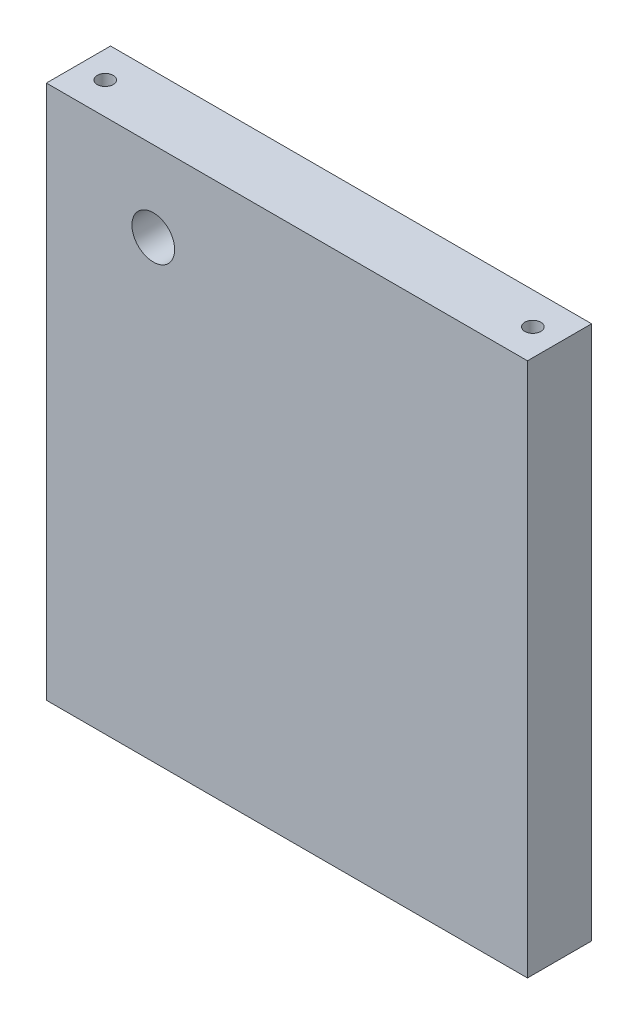
ISO-10303-21;
HEADER;
FILE_DESCRIPTION(('STEP AP214'),'2;1');
FILE_NAME('part.step','',(''),(''),'','','');
FILE_SCHEMA(('AUTOMOTIVE_DESIGN { 1 0 10303 214 1 1 1 1 }'));
ENDSEC;
DATA;
#1=APPLICATION_CONTEXT('core data for automotive mechanical design processes');
#2=APPLICATION_PROTOCOL_DEFINITION('international standard','automotive_design',2000,#1);
#3=PRODUCT_CONTEXT('',#1,'mechanical');
#4=PRODUCT('Part','Part','',(#3));
#5=PRODUCT_RELATED_PRODUCT_CATEGORY('part','',(#4));
#6=PRODUCT_DEFINITION_FORMATION('','',#4);
#7=PRODUCT_DEFINITION_CONTEXT('part definition',#1,'design');
#8=PRODUCT_DEFINITION('design','',#6,#7);
#9=PRODUCT_DEFINITION_SHAPE('','',#8);
#10=(LENGTH_UNIT() NAMED_UNIT(*) SI_UNIT(.MILLI.,.METRE.));
#11=(NAMED_UNIT(*) PLANE_ANGLE_UNIT() SI_UNIT($,.RADIAN.));
#12=(NAMED_UNIT(*) SI_UNIT($,.STERADIAN.) SOLID_ANGLE_UNIT());
#13=UNCERTAINTY_MEASURE_WITH_UNIT(LENGTH_MEASURE(1.E-05),#10,'distance_accuracy_value','');
#14=(GEOMETRIC_REPRESENTATION_CONTEXT(3) GLOBAL_UNCERTAINTY_ASSIGNED_CONTEXT((#13)) GLOBAL_UNIT_ASSIGNED_CONTEXT((#10,
#11,#12)) REPRESENTATION_CONTEXT('',''));
#15=CARTESIAN_POINT('',(0.,0.,0.));
#16=DIRECTION('',(0.,0.,1.));
#17=DIRECTION('',(1.,0.,0.));
#18=AXIS2_PLACEMENT_3D('',#15,#16,#17);
#19=CARTESIAN_POINT('',(0.,0.,0.));
#20=DIRECTION('',(0.,0.,1.));
#21=DIRECTION('',(1.,0.,0.));
#22=AXIS2_PLACEMENT_3D('',#19,#20,#21);
#23=PLANE('',#22);
#24=CARTESIAN_POINT('',(-82.9288397512637,45.9947342019556,0.));
#25=DIRECTION('',(0.,0.,1.));
#26=DIRECTION('',(1.,0.,0.));
#27=AXIS2_PLACEMENT_3D('',#24,#25,#26);
#28=CIRCLE('',#27,4.00000000000002);
#29=CARTESIAN_POINT('',(-78.9288397512637,45.9947342019556,0.));
#30=VERTEX_POINT('',#29);
#31=EDGE_CURVE('E619',#30,#30,#28,.T.);
#32=ORIENTED_EDGE('',*,*,#31,.T.);
#33=EDGE_LOOP('',(#32));
#34=FACE_BOUND('',#33,.T.);
#35=DIRECTION('',(0.,-1.,0.));
#36=VECTOR('',#35,1.);
#37=CARTESIAN_POINT('',(-44.9288397512637,0.,0.));
#38=LINE('',#37,#36);
#39=CARTESIAN_POINT('',(-44.9288397512637,47.5914000237829,0.));
#40=VERTEX_POINT('',#39);
#41=CARTESIAN_POINT('',(-44.9288397512637,-25.5627815535904,0.));
#42=VERTEX_POINT('',#41);
#43=EDGE_CURVE('E357',#40,#42,#38,.T.);
#44=ORIENTED_EDGE('',*,*,#43,.F.);
#45=DIRECTION('',(-0.707106781186549,-0.707106781186546,0.));
#46=VECTOR('',#45,1.);
#47=CARTESIAN_POINT('',(-41.2601198875232,51.2601198875234,0.));
#48=LINE('',#47,#46);
#49=CARTESIAN_POINT('',(-70.9288397512637,21.591400023783,0.));
#50=VERTEX_POINT('',#49);
#51=EDGE_CURVE('E257',#40,#50,#48,.T.);
#52=ORIENTED_EDGE('',*,*,#51,.T.);
#53=DIRECTION('',(0.,-1.,0.));
#54=VECTOR('',#53,1.);
#55=CARTESIAN_POINT('',(-70.9288397512637,0.,0.));
#56=LINE('',#55,#54);
#57=CARTESIAN_POINT('',(-70.9288397512637,-36.0052657980444,0.));
#58=VERTEX_POINT('',#57);
#59=EDGE_CURVE('E364',#50,#58,#56,.T.);
#60=ORIENTED_EDGE('',*,*,#59,.T.);
#61=DIRECTION('',(-1.,0.,0.));
#62=VECTOR('',#61,1.);
#63=CARTESIAN_POINT('',(0.,-36.0052657980444,0.));
#64=LINE('',#63,#62);
#65=CARTESIAN_POINT('',(-54.1286833085984,-36.0052657980444,0.));
#66=VERTEX_POINT('',#65);
#67=EDGE_CURVE('E367',#66,#58,#64,.T.);
#68=ORIENTED_EDGE('',*,*,#67,.F.);
#69=DIRECTION('',(-0.707106781186547,-0.707106781186548,0.));
#70=VECTOR('',#69,1.);
#71=CARTESIAN_POINT('',(-9.06170875527707,9.06170875527705,0.));
#72=LINE('',#71,#70);
#73=CARTESIAN_POINT('',(-45.807519407704,-27.68410189715,0.));
#74=VERTEX_POINT('',#73);
#75=EDGE_CURVE('E322',#74,#66,#72,.T.);
#76=ORIENTED_EDGE('',*,*,#75,.F.);
#77=CARTESIAN_POINT('',(-47.9288397512637,-25.5627815535904,0.));
#78=DIRECTION('',(0.,0.,1.));
#79=DIRECTION('',(1.,0.,0.));
#80=AXIS2_PLACEMENT_3D('',#77,#78,#79);
#81=CIRCLE('',#80,3.);
#82=EDGE_CURVE('E353',#42,#74,#81,.F.);
#83=ORIENTED_EDGE('',*,*,#82,.F.);
#84=EDGE_LOOP('',(#44,#52,#60,#68,#76,#83));
#85=FACE_BOUND('',#84,.T.);
#86=DIRECTION('',(0.,-1.,0.));
#87=VECTOR('',#86,1.);
#88=CARTESIAN_POINT('',(-102.928839751264,60.9947342019556,0.));
#89=LINE('',#88,#87);
#90=CARTESIAN_POINT('',(-102.928839751264,60.9947342019556,0.));
#91=VERTEX_POINT('',#90);
#92=CARTESIAN_POINT('',(-102.928839751264,-39.0052657980444,0.));
#93=VERTEX_POINT('',#92);
#94=EDGE_CURVE('E389',#91,#93,#89,.T.);
#95=ORIENTED_EDGE('',*,*,#94,.F.);
#96=DIRECTION('',(1.,0.,0.));
#97=VECTOR('',#96,1.);
#98=CARTESIAN_POINT('',(-102.928839751264,60.9947342019556,0.));
#99=LINE('',#98,#97);
#100=CARTESIAN_POINT('',(-12.9288397512637,60.9947342019556,0.));
#101=VERTEX_POINT('',#100);
#102=EDGE_CURVE('E408',#91,#101,#99,.T.);
#103=ORIENTED_EDGE('',*,*,#102,.T.);
#104=DIRECTION('',(0.,-1.,0.));
#105=VECTOR('',#104,1.);
#106=CARTESIAN_POINT('',(-12.9288397512637,60.9947342019556,0.));
#107=LINE('',#106,#105);
#108=CARTESIAN_POINT('',(-12.9288397512637,-39.0052657980444,0.));
#109=VERTEX_POINT('',#108);
#110=EDGE_CURVE('E427',#101,#109,#107,.T.);
#111=ORIENTED_EDGE('',*,*,#110,.T.);
#112=DIRECTION('',(1.,0.,0.));
#113=VECTOR('',#112,1.);
#114=CARTESIAN_POINT('',(-102.928839751264,-39.0052657980444,0.));
#115=LINE('',#114,#113);
#116=EDGE_CURVE('E423',#93,#109,#115,.T.);
#117=ORIENTED_EDGE('',*,*,#116,.F.);
#118=EDGE_LOOP('',(#95,#103,#111,#117));
#119=FACE_BOUND('',#118,.T.);
#120=ADVANCED_FACE('F42',(#34,#85,#119),#23,.F.);
#121=CARTESIAN_POINT('',(-102.928839751264,60.9947342019556,12.));
#122=DIRECTION('',(1.,0.,0.));
#123=DIRECTION('',(0.,1.,0.));
#124=AXIS2_PLACEMENT_3D('',#121,#122,#123);
#125=PLANE('',#124);
#126=ORIENTED_EDGE('',*,*,#94,.T.);
#127=DIRECTION('',(0.,0.,-1.));
#128=VECTOR('',#127,1.);
#129=CARTESIAN_POINT('',(-102.928839751264,-39.0052657980444,12.));
#130=LINE('',#129,#128);
#131=CARTESIAN_POINT('',(-102.928839751264,-39.0052657980444,12.));
#132=VERTEX_POINT('',#131);
#133=EDGE_CURVE('E442',#132,#93,#130,.T.);
#134=ORIENTED_EDGE('',*,*,#133,.F.);
#135=DIRECTION('',(0.,-1.,0.));
#136=VECTOR('',#135,1.);
#137=CARTESIAN_POINT('',(-102.928839751264,60.9947342019556,12.));
#138=LINE('',#137,#136);
#139=CARTESIAN_POINT('',(-102.928839751264,60.9947342019556,12.));
#140=VERTEX_POINT('',#139);
#141=EDGE_CURVE('E403',#140,#132,#138,.T.);
#142=ORIENTED_EDGE('',*,*,#141,.F.);
#143=DIRECTION('',(0.,0.,-1.));
#144=VECTOR('',#143,1.);
#145=CARTESIAN_POINT('',(-102.928839751264,60.9947342019556,12.));
#146=LINE('',#145,#144);
#147=EDGE_CURVE('E419',#140,#91,#146,.T.);
#148=ORIENTED_EDGE('',*,*,#147,.T.);
#149=EDGE_LOOP('',(#126,#134,#142,#148));
#150=FACE_BOUND('',#149,.T.);
#151=ADVANCED_FACE('F44',(#150),#125,.F.);
#152=CARTESIAN_POINT('',(-102.928839751264,-39.0052657980444,12.));
#153=DIRECTION('',(0.,1.,0.));
#154=DIRECTION('',(0.,0.,1.));
#155=AXIS2_PLACEMENT_3D('',#152,#153,#154);
#156=PLANE('',#155);
#157=CARTESIAN_POINT('',(-17.9288397512637,-39.0052657980444,5.99999999999999));
#158=DIRECTION('',(0.,1.,0.));
#159=DIRECTION('',(0.,0.,1.));
#160=AXIS2_PLACEMENT_3D('',#157,#158,#159);
#161=CIRCLE('',#160,1.5);
#162=CARTESIAN_POINT('',(-17.9288397512637,-39.0052657980444,7.5));
#163=VERTEX_POINT('',#162);
#164=EDGE_CURVE('E601',#163,#163,#161,.T.);
#165=ORIENTED_EDGE('',*,*,#164,.T.);
#166=EDGE_LOOP('',(#165));
#167=FACE_BOUND('',#166,.T.);
#168=CARTESIAN_POINT('',(-97.9288397512637,-39.0052657980444,6.));
#169=DIRECTION('',(0.,1.,0.));
#170=DIRECTION('',(0.,0.,1.));
#171=AXIS2_PLACEMENT_3D('',#168,#169,#170);
#172=CIRCLE('',#171,1.5);
#173=CARTESIAN_POINT('',(-97.9288397512637,-39.0052657980444,7.5));
#174=VERTEX_POINT('',#173);
#175=EDGE_CURVE('E604',#174,#174,#172,.T.);
#176=ORIENTED_EDGE('',*,*,#175,.T.);
#177=EDGE_LOOP('',(#176));
#178=FACE_BOUND('',#177,.T.);
#179=ORIENTED_EDGE('',*,*,#116,.T.);
#180=DIRECTION('',(0.,0.,-1.));
#181=VECTOR('',#180,1.);
#182=CARTESIAN_POINT('',(-12.9288397512637,-39.0052657980444,12.));
#183=LINE('',#182,#181);
#184=CARTESIAN_POINT('',(-12.9288397512637,-39.0052657980444,12.));
#185=VERTEX_POINT('',#184);
#186=EDGE_CURVE('E439',#185,#109,#183,.T.);
#187=ORIENTED_EDGE('',*,*,#186,.F.);
#188=DIRECTION('',(1.,0.,0.));
#189=VECTOR('',#188,1.);
#190=CARTESIAN_POINT('',(-102.928839751264,-39.0052657980444,12.));
#191=LINE('',#190,#189);
#192=EDGE_CURVE('E407',#132,#185,#191,.T.);
#193=ORIENTED_EDGE('',*,*,#192,.F.);
#194=ORIENTED_EDGE('',*,*,#133,.T.);
#195=EDGE_LOOP('',(#179,#187,#193,#194));
#196=FACE_BOUND('',#195,.T.);
#197=ADVANCED_FACE('F504',(#167,#178,#196),#156,.F.);
#198=CARTESIAN_POINT('',(-12.9288397512637,60.9947342019556,12.));
#199=DIRECTION('',(1.,0.,0.));
#200=DIRECTION('',(0.,1.,0.));
#201=AXIS2_PLACEMENT_3D('',#198,#199,#200);
#202=PLANE('',#201);
#203=ORIENTED_EDGE('',*,*,#110,.F.);
#204=DIRECTION('',(0.,0.,-1.));
#205=VECTOR('',#204,1.);
#206=CARTESIAN_POINT('',(-12.9288397512637,60.9947342019556,12.));
#207=LINE('',#206,#205);
#208=CARTESIAN_POINT('',(-12.9288397512637,60.9947342019556,12.));
#209=VERTEX_POINT('',#208);
#210=EDGE_CURVE('E436',#209,#101,#207,.T.);
#211=ORIENTED_EDGE('',*,*,#210,.F.);
#212=DIRECTION('',(0.,-1.,0.));
#213=VECTOR('',#212,1.);
#214=CARTESIAN_POINT('',(-12.9288397512637,60.9947342019556,12.));
#215=LINE('',#214,#213);
#216=EDGE_CURVE('E411',#209,#185,#215,.T.);
#217=ORIENTED_EDGE('',*,*,#216,.T.);
#218=ORIENTED_EDGE('',*,*,#186,.T.);
#219=EDGE_LOOP('',(#203,#211,#217,#218));
#220=FACE_BOUND('',#219,.T.);
#221=ADVANCED_FACE('F574',(#220),#202,.T.);
#222=CARTESIAN_POINT('',(-102.928839751264,60.9947342019556,12.));
#223=DIRECTION('',(0.,1.,0.));
#224=DIRECTION('',(0.,0.,1.));
#225=AXIS2_PLACEMENT_3D('',#222,#223,#224);
#226=PLANE('',#225);
#227=CARTESIAN_POINT('',(-17.9288397512637,60.9947342019556,5.99999999999999));
#228=DIRECTION('',(0.,1.,0.));
#229=DIRECTION('',(0.,0.,1.));
#230=AXIS2_PLACEMENT_3D('',#227,#228,#229);
#231=CIRCLE('',#230,1.5);
#232=CARTESIAN_POINT('',(-17.9288397512637,60.9947342019556,7.5));
#233=VERTEX_POINT('',#232);
#234=EDGE_CURVE('E607',#233,#233,#231,.T.);
#235=ORIENTED_EDGE('',*,*,#234,.F.);
#236=EDGE_LOOP('',(#235));
#237=FACE_BOUND('',#236,.T.);
#238=CARTESIAN_POINT('',(-97.9288397512637,60.9947342019556,6.));
#239=DIRECTION('',(0.,1.,0.));
#240=DIRECTION('',(0.,0.,1.));
#241=AXIS2_PLACEMENT_3D('',#238,#239,#240);
#242=CIRCLE('',#241,1.5);
#243=CARTESIAN_POINT('',(-97.9288397512637,60.9947342019556,7.5));
#244=VERTEX_POINT('',#243);
#245=EDGE_CURVE('E608',#244,#244,#242,.T.);
#246=ORIENTED_EDGE('',*,*,#245,.F.);
#247=EDGE_LOOP('',(#246));
#248=FACE_BOUND('',#247,.T.);
#249=ORIENTED_EDGE('',*,*,#102,.F.);
#250=ORIENTED_EDGE('',*,*,#147,.F.);
#251=DIRECTION('',(1.,0.,0.));
#252=VECTOR('',#251,1.);
#253=CARTESIAN_POINT('',(-102.928839751264,60.9947342019556,12.));
#254=LINE('',#253,#252);
#255=EDGE_CURVE('E415',#140,#209,#254,.T.);
#256=ORIENTED_EDGE('',*,*,#255,.T.);
#257=ORIENTED_EDGE('',*,*,#210,.T.);
#258=EDGE_LOOP('',(#249,#250,#256,#257));
#259=FACE_BOUND('',#258,.T.);
#260=ADVANCED_FACE('F569',(#237,#248,#259),#226,.T.);
#261=CARTESIAN_POINT('',(0.,0.,12.));
#262=DIRECTION('',(0.,0.,1.));
#263=DIRECTION('',(1.,0.,0.));
#264=AXIS2_PLACEMENT_3D('',#261,#262,#263);
#265=PLANE('',#264);
#266=CARTESIAN_POINT('',(-82.9288397512637,45.9947342019556,12.));
#267=DIRECTION('',(0.,0.,1.));
#268=DIRECTION('',(1.,0.,0.));
#269=AXIS2_PLACEMENT_3D('',#266,#267,#268);
#270=CIRCLE('',#269,4.00000000000002);
#271=CARTESIAN_POINT('',(-78.9288397512637,45.9947342019556,12.));
#272=VERTEX_POINT('',#271);
#273=EDGE_CURVE('E261',#272,#272,#270,.T.);
#274=ORIENTED_EDGE('',*,*,#273,.F.);
#275=EDGE_LOOP('',(#274));
#276=FACE_BOUND('',#275,.T.);
#277=ORIENTED_EDGE('',*,*,#141,.T.);
#278=ORIENTED_EDGE('',*,*,#192,.T.);
#279=ORIENTED_EDGE('',*,*,#216,.F.);
#280=ORIENTED_EDGE('',*,*,#255,.F.);
#281=EDGE_LOOP('',(#277,#278,#279,#280));
#282=FACE_BOUND('',#281,.T.);
#283=ADVANCED_FACE('F567',(#276,#282),#265,.T.);
#284=CARTESIAN_POINT('',(-9.06170875527707,9.06170875527705,3.));
#285=DIRECTION('',(0.707106781186548,-0.707106781186547,0.));
#286=DIRECTION('',(0.707106781186547,0.707106781186548,0.));
#287=AXIS2_PLACEMENT_3D('',#284,#285,#286);
#288=PLANE('',#287);
#289=ORIENTED_EDGE('',*,*,#75,.T.);
#290=DIRECTION('',(0.,0.,-1.));
#291=VECTOR('',#290,1.);
#292=CARTESIAN_POINT('',(-54.1286833085984,-36.0052657980444,3.));
#293=LINE('',#292,#291);
#294=CARTESIAN_POINT('',(-54.1286833085984,-36.0052657980444,3.));
#295=VERTEX_POINT('',#294);
#296=EDGE_CURVE('E350',#295,#66,#293,.T.);
#297=ORIENTED_EDGE('',*,*,#296,.F.);
#298=DIRECTION('',(-0.707106781186547,-0.707106781186548,0.));
#299=VECTOR('',#298,1.);
#300=CARTESIAN_POINT('',(-9.06170875527707,9.06170875527705,3.));
#301=LINE('',#300,#299);
#302=CARTESIAN_POINT('',(-45.807519407704,-27.68410189715,3.));
#303=VERTEX_POINT('',#302);
#304=EDGE_CURVE('E323',#303,#295,#301,.T.);
#305=ORIENTED_EDGE('',*,*,#304,.F.);
#306=DIRECTION('',(0.,0.,-1.));
#307=VECTOR('',#306,1.);
#308=CARTESIAN_POINT('',(-45.807519407704,-27.68410189715,3.));
#309=LINE('',#308,#307);
#310=EDGE_CURVE('E386',#303,#74,#309,.T.);
#311=ORIENTED_EDGE('',*,*,#310,.T.);
#312=EDGE_LOOP('',(#289,#297,#305,#311));
#313=FACE_BOUND('',#312,.T.);
#314=ADVANCED_FACE('F474',(#313),#288,.F.);
#315=CARTESIAN_POINT('',(-47.9288397512637,-25.5627815535904,3.));
#316=DIRECTION('',(0.,0.,-1.));
#317=DIRECTION('',(-1.,0.,0.));
#318=AXIS2_PLACEMENT_3D('',#315,#316,#317);
#319=CYLINDRICAL_SURFACE('',#318,3.);
#320=ORIENTED_EDGE('',*,*,#82,.T.);
#321=ORIENTED_EDGE('',*,*,#310,.F.);
#322=CARTESIAN_POINT('',(-47.9288397512637,-25.5627815535904,3.));
#323=DIRECTION('',(0.,0.,1.));
#324=DIRECTION('',(1.,0.,0.));
#325=AXIS2_PLACEMENT_3D('',#322,#323,#324);
#326=CIRCLE('',#325,3.);
#327=CARTESIAN_POINT('',(-44.9288397512637,-25.5627815535904,3.));
#328=VERTEX_POINT('',#327);
#329=EDGE_CURVE('E327',#328,#303,#326,.F.);
#330=ORIENTED_EDGE('',*,*,#329,.F.);
#331=DIRECTION('',(0.,0.,-1.));
#332=VECTOR('',#331,1.);
#333=CARTESIAN_POINT('',(-44.9288397512637,-25.5627815535904,3.));
#334=LINE('',#333,#332);
#335=EDGE_CURVE('E397',#328,#42,#334,.T.);
#336=ORIENTED_EDGE('',*,*,#335,.T.);
#337=EDGE_LOOP('',(#320,#321,#330,#336));
#338=FACE_BOUND('',#337,.T.);
#339=ADVANCED_FACE('F470',(#338),#319,.F.);
#340=CARTESIAN_POINT('',(-44.9288397512637,0.,3.));
#341=DIRECTION('',(1.,0.,0.));
#342=DIRECTION('',(0.,1.,0.));
#343=AXIS2_PLACEMENT_3D('',#340,#341,#342);
#344=PLANE('',#343);
#345=DIRECTION('',(0.,-1.,0.));
#346=VECTOR('',#345,1.);
#347=CARTESIAN_POINT('',(-44.9288397512637,0.,3.));
#348=LINE('',#347,#346);
#349=CARTESIAN_POINT('',(-44.9288397512637,-15.5627815535904,3.));
#350=VERTEX_POINT('',#349);
#351=EDGE_CURVE('E332',#350,#328,#348,.T.);
#352=ORIENTED_EDGE('',*,*,#351,.F.);
#353=DIRECTION('',(0.,0.,-1.));
#354=VECTOR('',#353,1.);
#355=CARTESIAN_POINT('',(-44.9288397512637,-15.5627815535904,7.));
#356=LINE('',#355,#354);
#357=CARTESIAN_POINT('',(-44.9288397512637,-15.5627815535904,7.));
#358=VERTEX_POINT('',#357);
#359=EDGE_CURVE('E208',#358,#350,#356,.T.);
#360=ORIENTED_EDGE('',*,*,#359,.F.);
#361=DIRECTION('',(0.,-1.,0.));
#362=VECTOR('',#361,1.);
#363=CARTESIAN_POINT('',(-44.9288397512637,9.99999999999999,7.));
#364=LINE('',#363,#362);
#365=CARTESIAN_POINT('',(-44.9288397512637,47.5914000237829,7.));
#366=VERTEX_POINT('',#365);
#367=EDGE_CURVE('E222',#366,#358,#364,.T.);
#368=ORIENTED_EDGE('',*,*,#367,.F.);
#369=DIRECTION('',(0.,0.,-1.));
#370=VECTOR('',#369,1.);
#371=CARTESIAN_POINT('',(-44.9288397512637,47.5914000237829,7.));
#372=LINE('',#371,#370);
#373=EDGE_CURVE('E303',#366,#40,#372,.T.);
#374=ORIENTED_EDGE('',*,*,#373,.T.);
#375=ORIENTED_EDGE('',*,*,#43,.T.);
#376=ORIENTED_EDGE('',*,*,#335,.F.);
#377=EDGE_LOOP('',(#352,#360,#368,#374,#375,#376));
#378=FACE_BOUND('',#377,.T.);
#379=ADVANCED_FACE('F463',(#378),#344,.F.);
#380=CARTESIAN_POINT('',(-70.9288397512637,0.,3.));
#381=DIRECTION('',(1.,0.,0.));
#382=DIRECTION('',(0.,1.,0.));
#383=AXIS2_PLACEMENT_3D('',#380,#381,#382);
#384=PLANE('',#383);
#385=ORIENTED_EDGE('',*,*,#59,.F.);
#386=DIRECTION('',(0.,0.,-1.));
#387=VECTOR('',#386,1.);
#388=CARTESIAN_POINT('',(-70.9288397512637,21.591400023783,7.));
#389=LINE('',#388,#387);
#390=CARTESIAN_POINT('',(-70.9288397512637,21.591400023783,7.));
#391=VERTEX_POINT('',#390);
#392=EDGE_CURVE('E299',#391,#50,#389,.T.);
#393=ORIENTED_EDGE('',*,*,#392,.F.);
#394=DIRECTION('',(0.,-1.,0.));
#395=VECTOR('',#394,1.);
#396=CARTESIAN_POINT('',(-70.9288397512637,9.99999999999998,7.));
#397=LINE('',#396,#395);
#398=CARTESIAN_POINT('',(-70.9288397512637,-26.0052657980444,7.));
#399=VERTEX_POINT('',#398);
#400=EDGE_CURVE('E232',#391,#399,#397,.T.);
#401=ORIENTED_EDGE('',*,*,#400,.T.);
#402=DIRECTION('',(0.,0.,-1.));
#403=VECTOR('',#402,1.);
#404=CARTESIAN_POINT('',(-70.9288397512637,-26.0052657980444,7.));
#405=LINE('',#404,#403);
#406=CARTESIAN_POINT('',(-70.9288397512637,-26.0052657980444,3.));
#407=VERTEX_POINT('',#406);
#408=EDGE_CURVE('E295',#399,#407,#405,.T.);
#409=ORIENTED_EDGE('',*,*,#408,.T.);
#410=DIRECTION('',(0.,-1.,0.));
#411=VECTOR('',#410,1.);
#412=CARTESIAN_POINT('',(-70.9288397512637,0.,3.));
#413=LINE('',#412,#411);
#414=CARTESIAN_POINT('',(-70.9288397512637,-36.0052657980444,3.));
#415=VERTEX_POINT('',#414);
#416=EDGE_CURVE('E339',#407,#415,#413,.T.);
#417=ORIENTED_EDGE('',*,*,#416,.T.);
#418=DIRECTION('',(0.,0.,-1.));
#419=VECTOR('',#418,1.);
#420=CARTESIAN_POINT('',(-70.9288397512637,-36.0052657980444,3.));
#421=LINE('',#420,#419);
#422=EDGE_CURVE('E393',#415,#58,#421,.T.);
#423=ORIENTED_EDGE('',*,*,#422,.T.);
#424=EDGE_LOOP('',(#385,#393,#401,#409,#417,#423));
#425=FACE_BOUND('',#424,.T.);
#426=ADVANCED_FACE('F457',(#425),#384,.T.);
#427=CARTESIAN_POINT('',(0.,-36.0052657980444,3.));
#428=DIRECTION('',(0.,-1.,0.));
#429=DIRECTION('',(0.,0.,-1.));
#430=AXIS2_PLACEMENT_3D('',#427,#428,#429);
#431=PLANE('',#430);
#432=ORIENTED_EDGE('',*,*,#67,.T.);
#433=ORIENTED_EDGE('',*,*,#422,.F.);
#434=DIRECTION('',(-1.,0.,0.));
#435=VECTOR('',#434,1.);
#436=CARTESIAN_POINT('',(0.,-36.0052657980444,3.));
#437=LINE('',#436,#435);
#438=EDGE_CURVE('E342',#295,#415,#437,.T.);
#439=ORIENTED_EDGE('',*,*,#438,.F.);
#440=ORIENTED_EDGE('',*,*,#296,.T.);
#441=EDGE_LOOP('',(#432,#433,#439,#440));
#442=FACE_BOUND('',#441,.T.);
#443=ADVANCED_FACE('F477',(#442),#431,.F.);
#444=CARTESIAN_POINT('',(0.,0.,3.));
#445=DIRECTION('',(0.,0.,1.));
#446=DIRECTION('',(1.,0.,0.));
#447=AXIS2_PLACEMENT_3D('',#444,#445,#446);
#448=PLANE('',#447);
#449=DIRECTION('',(0.707106781186547,0.707106781186548,0.));
#450=VECTOR('',#449,1.);
#451=CARTESIAN_POINT('',(-14.0617087552771,14.061708755277,3.));
#452=LINE('',#451,#450);
#453=CARTESIAN_POINT('',(-54.1286833085984,-26.0052657980444,3.));
#454=VERTEX_POINT('',#453);
#455=CARTESIAN_POINT('',(-45.807519407704,-17.68410189715,3.));
#456=VERTEX_POINT('',#455);
#457=EDGE_CURVE('E51',#454,#456,#452,.T.);
#458=ORIENTED_EDGE('',*,*,#457,.T.);
#459=CARTESIAN_POINT('',(-47.9288397512637,-15.5627815535904,3.));
#460=DIRECTION('',(0.,0.,1.));
#461=DIRECTION('',(1.,0.,0.));
#462=AXIS2_PLACEMENT_3D('',#459,#460,#461);
#463=CIRCLE('',#462,3.);
#464=EDGE_CURVE('E12',#456,#350,#463,.T.);
#465=ORIENTED_EDGE('',*,*,#464,.T.);
#466=ORIENTED_EDGE('',*,*,#351,.T.);
#467=ORIENTED_EDGE('',*,*,#329,.T.);
#468=ORIENTED_EDGE('',*,*,#304,.T.);
#469=ORIENTED_EDGE('',*,*,#438,.T.);
#470=ORIENTED_EDGE('',*,*,#416,.F.);
#471=DIRECTION('',(1.,0.,0.));
#472=VECTOR('',#471,1.);
#473=CARTESIAN_POINT('',(0.,-26.0052657980444,3.));
#474=LINE('',#473,#472);
#475=EDGE_CURVE('E446',#407,#454,#474,.T.);
#476=ORIENTED_EDGE('',*,*,#475,.T.);
#477=EDGE_LOOP('',(#458,#465,#466,#467,#468,#469,#470,#476));
#478=FACE_BOUND('',#477,.T.);
#479=ADVANCED_FACE('F451',(#478),#448,.F.);
#480=CARTESIAN_POINT('',(-9.06170875527707,19.0617087552771,7.));
#481=DIRECTION('',(0.707106781186548,-0.707106781186547,0.));
#482=DIRECTION('',(0.707106781186547,0.707106781186548,0.));
#483=AXIS2_PLACEMENT_3D('',#480,#481,#482);
#484=PLANE('',#483);
#485=DIRECTION('',(0.,0.,-1.));
#486=VECTOR('',#485,1.);
#487=CARTESIAN_POINT('',(-54.1286833085984,-26.0052657980444,7.));
#488=LINE('',#487,#486);
#489=CARTESIAN_POINT('',(-54.1286833085984,-26.0052657980444,7.));
#490=VERTEX_POINT('',#489);
#491=EDGE_CURVE('E58',#490,#454,#488,.T.);
#492=ORIENTED_EDGE('',*,*,#491,.F.);
#493=DIRECTION('',(-0.707106781186547,-0.707106781186548,0.));
#494=VECTOR('',#493,1.);
#495=CARTESIAN_POINT('',(-9.06170875527707,19.0617087552771,7.));
#496=LINE('',#495,#494);
#497=CARTESIAN_POINT('',(-45.807519407704,-17.68410189715,7.));
#498=VERTEX_POINT('',#497);
#499=EDGE_CURVE('E211',#498,#490,#496,.T.);
#500=ORIENTED_EDGE('',*,*,#499,.F.);
#501=DIRECTION('',(0.,0.,-1.));
#502=VECTOR('',#501,1.);
#503=CARTESIAN_POINT('',(-45.807519407704,-17.68410189715,7.));
#504=LINE('',#503,#502);
#505=EDGE_CURVE('E198',#498,#456,#504,.T.);
#506=ORIENTED_EDGE('',*,*,#505,.T.);
#507=ORIENTED_EDGE('',*,*,#457,.F.);
#508=EDGE_LOOP('',(#492,#500,#506,#507));
#509=FACE_BOUND('',#508,.T.);
#510=ADVANCED_FACE('F212',(#509),#484,.F.);
#511=CARTESIAN_POINT('',(-47.9288397512637,-15.5627815535904,7.));
#512=DIRECTION('',(0.,0.,-1.));
#513=DIRECTION('',(-1.,0.,0.));
#514=AXIS2_PLACEMENT_3D('',#511,#512,#513);
#515=CYLINDRICAL_SURFACE('',#514,3.);
#516=ORIENTED_EDGE('',*,*,#505,.F.);
#517=CARTESIAN_POINT('',(-47.9288397512637,-15.5627815535904,7.));
#518=DIRECTION('',(0.,0.,1.));
#519=DIRECTION('',(1.,0.,0.));
#520=AXIS2_PLACEMENT_3D('',#517,#518,#519);
#521=CIRCLE('',#520,3.);
#522=EDGE_CURVE('E202',#358,#498,#521,.F.);
#523=ORIENTED_EDGE('',*,*,#522,.F.);
#524=ORIENTED_EDGE('',*,*,#359,.T.);
#525=ORIENTED_EDGE('',*,*,#464,.F.);
#526=EDGE_LOOP('',(#516,#523,#524,#525));
#527=FACE_BOUND('',#526,.T.);
#528=ADVANCED_FACE('F200',(#527),#515,.F.);
#529=CARTESIAN_POINT('',(0.,-26.0052657980444,7.));
#530=DIRECTION('',(0.,-1.,0.));
#531=DIRECTION('',(0.,0.,-1.));
#532=AXIS2_PLACEMENT_3D('',#529,#530,#531);
#533=PLANE('',#532);
#534=ORIENTED_EDGE('',*,*,#408,.F.);
#535=DIRECTION('',(-1.,0.,0.));
#536=VECTOR('',#535,1.);
#537=CARTESIAN_POINT('',(0.,-26.0052657980444,7.));
#538=LINE('',#537,#536);
#539=EDGE_CURVE('E235',#490,#399,#538,.T.);
#540=ORIENTED_EDGE('',*,*,#539,.F.);
#541=ORIENTED_EDGE('',*,*,#491,.T.);
#542=ORIENTED_EDGE('',*,*,#475,.F.);
#543=EDGE_LOOP('',(#534,#540,#541,#542));
#544=FACE_BOUND('',#543,.T.);
#545=ADVANCED_FACE('F455',(#544),#533,.F.);
#546=CARTESIAN_POINT('',(0.148103045121744,9.59309022777553,7.));
#547=DIRECTION('',(-0.342020143325663,0.93969262078591,0.));
#548=DIRECTION('',(-0.93969262078591,-0.342020143325663,0.));
#549=AXIS2_PLACEMENT_3D('',#546,#547,#548);
#550=PLANE('',#549);
#551=DIRECTION('',(0.939692620785911,0.342020143325663,0.));
#552=VECTOR('',#551,1.);
#553=CARTESIAN_POINT('',(0.148103045121744,9.59309022777553,0.));
#554=LINE('',#553,#552);
#555=CARTESIAN_POINT('',(-64.9288397512637,-14.0929798871527,0.));
#556=VERTEX_POINT('',#555);
#557=CARTESIAN_POINT('',(-56.4630607050439,-11.0116883044542,0.));
#558=VERTEX_POINT('',#557);
#559=EDGE_CURVE('E66',#556,#558,#554,.T.);
#560=ORIENTED_EDGE('',*,*,#559,.T.);
#561=DIRECTION('',(0.,0.,-1.));
#562=VECTOR('',#561,1.);
#563=CARTESIAN_POINT('',(-56.4630607050439,-11.0116883044542,7.));
#564=LINE('',#563,#562);
#565=CARTESIAN_POINT('',(-56.4630607050439,-11.0116883044542,7.));
#566=VERTEX_POINT('',#565);
#567=EDGE_CURVE('E207',#566,#558,#564,.T.);
#568=ORIENTED_EDGE('',*,*,#567,.F.);
#569=DIRECTION('',(0.939692620785911,0.342020143325663,0.));
#570=VECTOR('',#569,1.);
#571=CARTESIAN_POINT('',(0.148103045121744,9.59309022777553,7.));
#572=LINE('',#571,#570);
#573=CARTESIAN_POINT('',(-64.9288397512637,-14.0929798871527,7.));
#574=VERTEX_POINT('',#573);
#575=EDGE_CURVE('E238',#574,#566,#572,.T.);
#576=ORIENTED_EDGE('',*,*,#575,.F.);
#577=DIRECTION('',(0.,0.,-1.));
#578=VECTOR('',#577,1.);
#579=CARTESIAN_POINT('',(-64.9288397512637,-14.0929798871527,7.));
#580=LINE('',#579,#578);
#581=EDGE_CURVE('E289',#574,#556,#580,.T.);
#582=ORIENTED_EDGE('',*,*,#581,.T.);
#583=EDGE_LOOP('',(#560,#568,#576,#582));
#584=FACE_BOUND('',#583,.T.);
#585=ADVANCED_FACE('F491',(#584),#550,.F.);
#586=CARTESIAN_POINT('',(-37.017479200404,47.0174792004041,7.));
#587=DIRECTION('',(0.707106781186547,-0.707106781186549,0.));
#588=DIRECTION('',(0.707106781186549,0.707106781186546,0.));
#589=AXIS2_PLACEMENT_3D('',#586,#587,#588);
#590=PLANE('',#589);
#591=DIRECTION('',(-0.707106781186549,-0.707106781186546,0.));
#592=VECTOR('',#591,1.);
#593=CARTESIAN_POINT('',(-37.017479200404,47.0174792004041,0.));
#594=LINE('',#593,#592);
#595=CARTESIAN_POINT('',(-50.9288397512637,33.1061186495444,0.));
#596=VERTEX_POINT('',#595);
#597=CARTESIAN_POINT('',(-64.9288397512637,19.1061186495444,0.));
#598=VERTEX_POINT('',#597);
#599=EDGE_CURVE('E267',#596,#598,#594,.T.);
#600=ORIENTED_EDGE('',*,*,#599,.T.);
#601=DIRECTION('',(0.,0.,-1.));
#602=VECTOR('',#601,1.);
#603=CARTESIAN_POINT('',(-64.9288397512637,19.1061186495444,7.));
#604=LINE('',#603,#602);
#605=CARTESIAN_POINT('',(-64.9288397512637,19.1061186495444,7.));
#606=VERTEX_POINT('',#605);
#607=EDGE_CURVE('E286',#606,#598,#604,.T.);
#608=ORIENTED_EDGE('',*,*,#607,.F.);
#609=DIRECTION('',(-0.707106781186549,-0.707106781186546,0.));
#610=VECTOR('',#609,1.);
#611=CARTESIAN_POINT('',(-37.017479200404,47.0174792004041,7.));
#612=LINE('',#611,#610);
#613=CARTESIAN_POINT('',(-50.9288397512637,33.1061186495444,7.));
#614=VERTEX_POINT('',#613);
#615=EDGE_CURVE('E246',#614,#606,#612,.T.);
#616=ORIENTED_EDGE('',*,*,#615,.F.);
#617=DIRECTION('',(0.,0.,-1.));
#618=VECTOR('',#617,1.);
#619=CARTESIAN_POINT('',(-50.9288397512637,33.1061186495444,7.));
#620=LINE('',#619,#618);
#621=EDGE_CURVE('E283',#614,#596,#620,.T.);
#622=ORIENTED_EDGE('',*,*,#621,.T.);
#623=EDGE_LOOP('',(#600,#608,#616,#622));
#624=FACE_BOUND('',#623,.T.);
#625=ADVANCED_FACE('F483',(#624),#590,.F.);
#626=CARTESIAN_POINT('',(-41.2601198875232,51.2601198875234,7.));
#627=DIRECTION('',(0.707106781186547,-0.707106781186549,0.));
#628=DIRECTION('',(0.707106781186549,0.707106781186546,0.));
#629=AXIS2_PLACEMENT_3D('',#626,#627,#628);
#630=PLANE('',#629);
#631=ORIENTED_EDGE('',*,*,#51,.F.);
#632=ORIENTED_EDGE('',*,*,#373,.F.);
#633=DIRECTION('',(-0.707106781186549,-0.707106781186546,0.));
#634=VECTOR('',#633,1.);
#635=CARTESIAN_POINT('',(-41.2601198875232,51.2601198875234,7.));
#636=LINE('',#635,#634);
#637=EDGE_CURVE('E226',#366,#391,#636,.T.);
#638=ORIENTED_EDGE('',*,*,#637,.T.);
#639=ORIENTED_EDGE('',*,*,#392,.T.);
#640=EDGE_LOOP('',(#631,#632,#638,#639));
#641=FACE_BOUND('',#640,.T.);
#642=ADVANCED_FACE('F480',(#641),#630,.T.);
#643=CARTESIAN_POINT('',(-5.29577992946525,-20.0338604346739,7.));
#644=DIRECTION('',(0.173648177666923,0.984807753012209,0.));
#645=DIRECTION('',(-0.984807753012209,0.173648177666923,0.));
#646=AXIS2_PLACEMENT_3D('',#643,#644,#645);
#647=PLANE('',#646);
#648=DIRECTION('',(0.984807753012209,-0.173648177666923,0.));
#649=VECTOR('',#648,1.);
#650=CARTESIAN_POINT('',(-5.29577992946525,-20.0338604346739,0.));
#651=LINE('',#650,#649);
#652=CARTESIAN_POINT('',(-50.9288397512637,-11.9875207758078,0.));
#653=VERTEX_POINT('',#652);
#654=EDGE_CURVE('E216',#558,#653,#651,.T.);
#655=ORIENTED_EDGE('',*,*,#654,.T.);
#656=DIRECTION('',(0.,0.,-1.));
#657=VECTOR('',#656,1.);
#658=CARTESIAN_POINT('',(-50.9288397512637,-11.9875207758078,7.));
#659=LINE('',#658,#657);
#660=CARTESIAN_POINT('',(-50.9288397512637,-11.9875207758078,7.));
#661=VERTEX_POINT('',#660);
#662=EDGE_CURVE('E280',#661,#653,#659,.T.);
#663=ORIENTED_EDGE('',*,*,#662,.F.);
#664=DIRECTION('',(0.984807753012209,-0.173648177666923,0.));
#665=VECTOR('',#664,1.);
#666=CARTESIAN_POINT('',(-5.29577992946525,-20.0338604346739,7.));
#667=LINE('',#666,#665);
#668=EDGE_CURVE('E253',#566,#661,#667,.T.);
#669=ORIENTED_EDGE('',*,*,#668,.F.);
#670=ORIENTED_EDGE('',*,*,#567,.T.);
#671=EDGE_LOOP('',(#655,#663,#669,#670));
#672=FACE_BOUND('',#671,.T.);
#673=ADVANCED_FACE('F482',(#672),#647,.F.);
#674=CARTESIAN_POINT('',(0.,10.,7.));
#675=DIRECTION('',(0.,0.,1.));
#676=DIRECTION('',(1.,0.,0.));
#677=AXIS2_PLACEMENT_3D('',#674,#675,#676);
#678=PLANE('',#677);
#679=ORIENTED_EDGE('',*,*,#499,.T.);
#680=ORIENTED_EDGE('',*,*,#539,.T.);
#681=ORIENTED_EDGE('',*,*,#400,.F.);
#682=ORIENTED_EDGE('',*,*,#637,.F.);
#683=ORIENTED_EDGE('',*,*,#367,.T.);
#684=ORIENTED_EDGE('',*,*,#522,.T.);
#685=EDGE_LOOP('',(#679,#680,#681,#682,#683,#684));
#686=FACE_BOUND('',#685,.T.);
#687=ORIENTED_EDGE('',*,*,#575,.T.);
#688=ORIENTED_EDGE('',*,*,#668,.T.);
#689=DIRECTION('',(0.,-1.,0.));
#690=VECTOR('',#689,1.);
#691=CARTESIAN_POINT('',(-50.9288397512637,9.99999999999999,7.));
#692=LINE('',#691,#690);
#693=EDGE_CURVE('E250',#614,#661,#692,.T.);
#694=ORIENTED_EDGE('',*,*,#693,.F.);
#695=ORIENTED_EDGE('',*,*,#615,.T.);
#696=DIRECTION('',(0.,-1.,0.));
#697=VECTOR('',#696,1.);
#698=CARTESIAN_POINT('',(-64.9288397512637,9.99999999999998,7.));
#699=LINE('',#698,#697);
#700=EDGE_CURVE('E242',#606,#574,#699,.T.);
#701=ORIENTED_EDGE('',*,*,#700,.T.);
#702=EDGE_LOOP('',(#687,#688,#694,#695,#701));
#703=FACE_BOUND('',#702,.T.);
#704=ADVANCED_FACE('F218',(#686,#703),#678,.F.);
#705=DIRECTION('',(-0.707106781186549,-0.707106781186546,0.));
#706=VECTOR('',#705,1.);
#707=CARTESIAN_POINT('',(-37.017479200404,37.0174792004041,3.));
#708=LINE('',#707,#706);
#709=CARTESIAN_POINT('',(-50.9288397512637,23.1061186495444,3.));
#710=VERTEX_POINT('',#709);
#711=CARTESIAN_POINT('',(-64.9288397512637,9.10611864954438,3.));
#712=VERTEX_POINT('',#711);
#713=EDGE_CURVE('E346',#710,#712,#708,.T.);
#714=ORIENTED_EDGE('',*,*,#713,.T.);
#715=DIRECTION('',(0.,1.,0.));
#716=VECTOR('',#715,1.);
#717=CARTESIAN_POINT('',(-64.9288397512637,0.,3.));
#718=LINE('',#717,#716);
#719=CARTESIAN_POINT('',(-64.9288397512637,17.5914000237829,3.));
#720=VERTEX_POINT('',#719);
#721=EDGE_CURVE('E315',#712,#720,#718,.T.);
#722=ORIENTED_EDGE('',*,*,#721,.T.);
#723=DIRECTION('',(-0.707106781186549,-0.707106781186546,0.));
#724=VECTOR('',#723,1.);
#725=CARTESIAN_POINT('',(-41.2601198875232,41.2601198875234,3.));
#726=LINE('',#725,#724);
#727=CARTESIAN_POINT('',(-50.9288397512637,31.5914000237829,3.));
#728=VERTEX_POINT('',#727);
#729=EDGE_CURVE('E335',#728,#720,#726,.T.);
#730=ORIENTED_EDGE('',*,*,#729,.F.);
#731=DIRECTION('',(0.,1.,0.));
#732=VECTOR('',#731,1.);
#733=CARTESIAN_POINT('',(-50.9288397512637,0.,3.));
#734=LINE('',#733,#732);
#735=EDGE_CURVE('E292',#710,#728,#734,.T.);
#736=ORIENTED_EDGE('',*,*,#735,.F.);
#737=EDGE_LOOP('',(#714,#722,#730,#736));
#738=FACE_BOUND('',#737,.T.);
#739=ADVANCED_FACE('F522',(#738),#448,.F.);
#740=CARTESIAN_POINT('',(-41.2601198875232,41.2601198875234,3.));
#741=DIRECTION('',(0.707106781186546,-0.707106781186548,0.));
#742=DIRECTION('',(0.707106781186549,0.707106781186546,0.));
#743=AXIS2_PLACEMENT_3D('',#740,#741,#742);
#744=PLANE('',#743);
#745=DIRECTION('',(0.,0.,1.));
#746=VECTOR('',#745,1.);
#747=CARTESIAN_POINT('',(-64.9288397512637,17.5914000237829,3.));
#748=LINE('',#747,#746);
#749=CARTESIAN_POINT('',(-64.9288397512637,17.5914000237829,0.));
#750=VERTEX_POINT('',#749);
#751=EDGE_CURVE('E319',#750,#720,#748,.T.);
#752=ORIENTED_EDGE('',*,*,#751,.F.);
#753=DIRECTION('',(-0.707106781186549,-0.707106781186546,0.));
#754=VECTOR('',#753,1.);
#755=CARTESIAN_POINT('',(-41.2601198875232,41.2601198875234,0.));
#756=LINE('',#755,#754);
#757=CARTESIAN_POINT('',(-50.9288397512637,31.5914000237829,0.));
#758=VERTEX_POINT('',#757);
#759=EDGE_CURVE('E360',#758,#750,#756,.T.);
#760=ORIENTED_EDGE('',*,*,#759,.F.);
#761=DIRECTION('',(0.,0.,1.));
#762=VECTOR('',#761,1.);
#763=CARTESIAN_POINT('',(-50.9288397512637,31.5914000237829,3.));
#764=LINE('',#763,#762);
#765=EDGE_CURVE('E311',#758,#728,#764,.T.);
#766=ORIENTED_EDGE('',*,*,#765,.T.);
#767=ORIENTED_EDGE('',*,*,#729,.T.);
#768=EDGE_LOOP('',(#752,#760,#766,#767));
#769=FACE_BOUND('',#768,.T.);
#770=ADVANCED_FACE('F514',(#769),#744,.T.);
#771=ORIENTED_EDGE('',*,*,#759,.T.);
#772=DIRECTION('',(0.,-1.,0.));
#773=VECTOR('',#772,1.);
#774=CARTESIAN_POINT('',(-64.9288397512637,9.99999999999998,0.));
#775=LINE('',#774,#773);
#776=EDGE_CURVE('E264',#598,#750,#775,.T.);
#777=ORIENTED_EDGE('',*,*,#776,.F.);
#778=ORIENTED_EDGE('',*,*,#599,.F.);
#779=DIRECTION('',(0.,-1.,0.));
#780=VECTOR('',#779,1.);
#781=CARTESIAN_POINT('',(-50.9288397512637,9.99999999999999,0.));
#782=LINE('',#781,#780);
#783=EDGE_CURVE('E271',#596,#758,#782,.T.);
#784=ORIENTED_EDGE('',*,*,#783,.T.);
#785=EDGE_LOOP('',(#771,#777,#778,#784));
#786=FACE_BOUND('',#785,.T.);
#787=ADVANCED_FACE('F500',(#786),#23,.F.);
#788=CARTESIAN_POINT('',(-37.017479200404,37.0174792004041,3.));
#789=DIRECTION('',(0.707106781186546,-0.707106781186548,0.));
#790=DIRECTION('',(0.707106781186549,0.707106781186546,0.));
#791=AXIS2_PLACEMENT_3D('',#788,#789,#790);
#792=PLANE('',#791);
#793=DIRECTION('',(-0.707106781186549,-0.707106781186546,0.));
#794=VECTOR('',#793,1.);
#795=CARTESIAN_POINT('',(-37.017479200404,37.0174792004041,0.));
#796=LINE('',#795,#794);
#797=CARTESIAN_POINT('',(-50.9288397512637,23.1061186495444,0.));
#798=VERTEX_POINT('',#797);
#799=CARTESIAN_POINT('',(-64.9288397512637,9.10611864954439,0.));
#800=VERTEX_POINT('',#799);
#801=EDGE_CURVE('E375',#798,#800,#796,.T.);
#802=ORIENTED_EDGE('',*,*,#801,.T.);
#803=DIRECTION('',(0.,0.,-1.));
#804=VECTOR('',#803,1.);
#805=CARTESIAN_POINT('',(-64.9288397512637,9.10611864954439,3.));
#806=LINE('',#805,#804);
#807=EDGE_CURVE('E385',#712,#800,#806,.T.);
#808=ORIENTED_EDGE('',*,*,#807,.F.);
#809=ORIENTED_EDGE('',*,*,#713,.F.);
#810=DIRECTION('',(0.,0.,-1.));
#811=VECTOR('',#810,1.);
#812=CARTESIAN_POINT('',(-50.9288397512637,23.1061186495444,3.));
#813=LINE('',#812,#811);
#814=EDGE_CURVE('E382',#710,#798,#813,.T.);
#815=ORIENTED_EDGE('',*,*,#814,.T.);
#816=EDGE_LOOP('',(#802,#808,#809,#815));
#817=FACE_BOUND('',#816,.T.);
#818=ADVANCED_FACE('F511',(#817),#792,.F.);
#819=ORIENTED_EDGE('',*,*,#654,.F.);
#820=ORIENTED_EDGE('',*,*,#559,.F.);
#821=DIRECTION('',(0.,-1.,0.));
#822=VECTOR('',#821,1.);
#823=CARTESIAN_POINT('',(-64.9288397512637,0.,0.));
#824=LINE('',#823,#822);
#825=EDGE_CURVE('E371',#800,#556,#824,.T.);
#826=ORIENTED_EDGE('',*,*,#825,.F.);
#827=ORIENTED_EDGE('',*,*,#801,.F.);
#828=DIRECTION('',(0.,-1.,0.));
#829=VECTOR('',#828,1.);
#830=CARTESIAN_POINT('',(-50.9288397512637,0.,0.));
#831=LINE('',#830,#829);
#832=EDGE_CURVE('E328',#798,#653,#831,.T.);
#833=ORIENTED_EDGE('',*,*,#832,.T.);
#834=EDGE_LOOP('',(#819,#820,#826,#827,#833));
#835=FACE_BOUND('',#834,.T.);
#836=ADVANCED_FACE('F499',(#835),#23,.F.);
#837=CARTESIAN_POINT('',(-50.9288397512637,0.,3.));
#838=DIRECTION('',(1.,0.,0.));
#839=DIRECTION('',(0.,1.,0.));
#840=AXIS2_PLACEMENT_3D('',#837,#838,#839);
#841=PLANE('',#840);
#842=ORIENTED_EDGE('',*,*,#662,.T.);
#843=ORIENTED_EDGE('',*,*,#832,.F.);
#844=ORIENTED_EDGE('',*,*,#814,.F.);
#845=ORIENTED_EDGE('',*,*,#735,.T.);
#846=ORIENTED_EDGE('',*,*,#765,.F.);
#847=ORIENTED_EDGE('',*,*,#783,.F.);
#848=ORIENTED_EDGE('',*,*,#621,.F.);
#849=ORIENTED_EDGE('',*,*,#693,.T.);
#850=EDGE_LOOP('',(#842,#843,#844,#845,#846,#847,#848,#849));
#851=FACE_BOUND('',#850,.T.);
#852=ADVANCED_FACE('F510',(#851),#841,.T.);
#853=CARTESIAN_POINT('',(-64.9288397512637,0.,3.));
#854=DIRECTION('',(1.,0.,0.));
#855=DIRECTION('',(0.,1.,0.));
#856=AXIS2_PLACEMENT_3D('',#853,#854,#855);
#857=PLANE('',#856);
#858=ORIENTED_EDGE('',*,*,#825,.T.);
#859=ORIENTED_EDGE('',*,*,#581,.F.);
#860=ORIENTED_EDGE('',*,*,#700,.F.);
#861=ORIENTED_EDGE('',*,*,#607,.T.);
#862=ORIENTED_EDGE('',*,*,#776,.T.);
#863=ORIENTED_EDGE('',*,*,#751,.T.);
#864=ORIENTED_EDGE('',*,*,#721,.F.);
#865=ORIENTED_EDGE('',*,*,#807,.T.);
#866=EDGE_LOOP('',(#858,#859,#860,#861,#862,#863,#864,#865));
#867=FACE_BOUND('',#866,.T.);
#868=ADVANCED_FACE('F532',(#867),#857,.F.);
#869=CARTESIAN_POINT('',(-82.9288397512637,45.9947342019556,12.));
#870=DIRECTION('',(0.,0.,-1.));
#871=DIRECTION('',(-1.,0.,0.));
#872=AXIS2_PLACEMENT_3D('',#869,#870,#871);
#873=CYLINDRICAL_SURFACE('',#872,4.00000000000002);
#874=ORIENTED_EDGE('',*,*,#273,.T.);
#875=EDGE_LOOP('',(#874));
#876=FACE_BOUND('',#875,.T.);
#877=ORIENTED_EDGE('',*,*,#31,.F.);
#878=EDGE_LOOP('',(#877));
#879=FACE_BOUND('',#878,.T.);
#880=ADVANCED_FACE('F553',(#876,#879),#873,.F.);
#881=CARTESIAN_POINT('',(-97.9288397512637,-39.0052657980444,6.));
#882=DIRECTION('',(0.,1.,0.));
#883=DIRECTION('',(0.,0.,1.));
#884=AXIS2_PLACEMENT_3D('',#881,#882,#883);
#885=CYLINDRICAL_SURFACE('',#884,1.5);
#886=ORIENTED_EDGE('',*,*,#175,.F.);
#887=EDGE_LOOP('',(#886));
#888=FACE_BOUND('',#887,.T.);
#889=ORIENTED_EDGE('',*,*,#245,.T.);
#890=EDGE_LOOP('',(#889));
#891=FACE_BOUND('',#890,.T.);
#892=ADVANCED_FACE('F625',(#888,#891),#885,.F.);
#893=CARTESIAN_POINT('',(-17.9288397512637,-39.0052657980444,5.99999999999999));
#894=DIRECTION('',(0.,1.,0.));
#895=DIRECTION('',(0.,0.,1.));
#896=AXIS2_PLACEMENT_3D('',#893,#894,#895);
#897=CYLINDRICAL_SURFACE('',#896,1.5);
#898=ORIENTED_EDGE('',*,*,#164,.F.);
#899=EDGE_LOOP('',(#898));
#900=FACE_BOUND('',#899,.T.);
#901=ORIENTED_EDGE('',*,*,#234,.T.);
#902=EDGE_LOOP('',(#901));
#903=FACE_BOUND('',#902,.T.);
#904=ADVANCED_FACE('F631',(#900,#903),#897,.F.);
#905=CLOSED_SHELL('',(#120,#151,#197,#221,#260,#283,#314,#339,#379,#426,#443,#479,#510,#528,
#545,#585,#625,#642,#673,#704,#739,#770,#787,#818,#836,#852,#868,#880,#892,#904));
#906=MANIFOLD_SOLID_BREP('B2',#905);
#907=ADVANCED_BREP_SHAPE_REPRESENTATION('',(#18,#906),#14);
#908=SHAPE_DEFINITION_REPRESENTATION(#9,#907);
ENDSEC;
END-ISO-10303-21;
